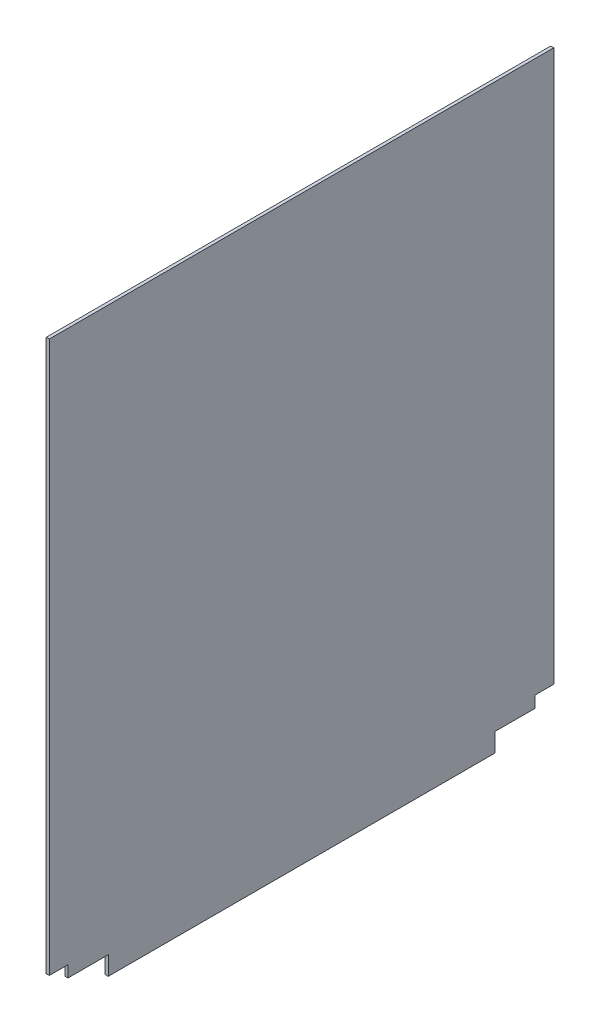
ISO-10303-21;
HEADER;
FILE_DESCRIPTION(('STEP AP214'),'2;1');
FILE_NAME('part.step','',(''),(''),'','','');
FILE_SCHEMA(('AUTOMOTIVE_DESIGN { 1 0 10303 214 1 1 1 1 }'));
ENDSEC;
DATA;
#1=APPLICATION_CONTEXT('core data for automotive mechanical design processes');
#2=APPLICATION_PROTOCOL_DEFINITION('international standard','automotive_design',2000,#1);
#3=PRODUCT_CONTEXT('',#1,'mechanical');
#4=PRODUCT('Part','Part','',(#3));
#5=PRODUCT_RELATED_PRODUCT_CATEGORY('part','',(#4));
#6=PRODUCT_DEFINITION_FORMATION('','',#4);
#7=PRODUCT_DEFINITION_CONTEXT('part definition',#1,'design');
#8=PRODUCT_DEFINITION('design','',#6,#7);
#9=PRODUCT_DEFINITION_SHAPE('','',#8);
#10=(LENGTH_UNIT() NAMED_UNIT(*) SI_UNIT(.MILLI.,.METRE.));
#11=(NAMED_UNIT(*) PLANE_ANGLE_UNIT() SI_UNIT($,.RADIAN.));
#12=(NAMED_UNIT(*) SI_UNIT($,.STERADIAN.) SOLID_ANGLE_UNIT());
#13=UNCERTAINTY_MEASURE_WITH_UNIT(LENGTH_MEASURE(1.E-05),#10,'distance_accuracy_value','');
#14=(GEOMETRIC_REPRESENTATION_CONTEXT(3) GLOBAL_UNCERTAINTY_ASSIGNED_CONTEXT((#13)) GLOBAL_UNIT_ASSIGNED_CONTEXT((#10,
#11,#12)) REPRESENTATION_CONTEXT('',''));
#15=CARTESIAN_POINT('',(0.,0.,0.));
#16=DIRECTION('',(0.,0.,1.));
#17=DIRECTION('',(1.,0.,0.));
#18=AXIS2_PLACEMENT_3D('',#15,#16,#17);
#19=CARTESIAN_POINT('',(3.175,303.0375,-262.95));
#20=DIRECTION('',(0.,0.,1.));
#21=DIRECTION('',(0.,-1.,0.));
#22=AXIS2_PLACEMENT_3D('',#19,#20,#21);
#23=PLANE('',#22);
#24=DIRECTION('',(1.,0.,0.));
#25=VECTOR('',#24,1.);
#26=CARTESIAN_POINT('',(-2.67147415300428E-13,-271.537499999997,-262.95));
#27=LINE('',#26,#25);
#28=CARTESIAN_POINT('',(-2.67147415300428E-13,-271.537499999997,-262.95));
#29=VERTEX_POINT('',#28);
#30=CARTESIAN_POINT('',(3.175,-271.537499999997,-262.95));
#31=VERTEX_POINT('',#30);
#32=EDGE_CURVE('E138',#29,#31,#27,.T.);
#33=ORIENTED_EDGE('',*,*,#32,.F.);
#34=DIRECTION('',(0.,1.,0.));
#35=VECTOR('',#34,1.);
#36=CARTESIAN_POINT('',(0.,303.0375,-262.95));
#37=LINE('',#36,#35);
#38=CARTESIAN_POINT('',(0.,303.0375,-262.95));
#39=VERTEX_POINT('',#38);
#40=EDGE_CURVE('E72',#29,#39,#37,.T.);
#41=ORIENTED_EDGE('',*,*,#40,.T.);
#42=DIRECTION('',(-1.,0.,0.));
#43=VECTOR('',#42,1.);
#44=CARTESIAN_POINT('',(3.175,303.0375,-262.95));
#45=LINE('',#44,#43);
#46=CARTESIAN_POINT('',(3.175,303.0375,-262.95));
#47=VERTEX_POINT('',#46);
#48=EDGE_CURVE('E170',#47,#39,#45,.T.);
#49=ORIENTED_EDGE('',*,*,#48,.F.);
#50=DIRECTION('',(0.,1.,0.));
#51=VECTOR('',#50,1.);
#52=CARTESIAN_POINT('',(3.175,303.0375,-262.95));
#53=LINE('',#52,#51);
#54=EDGE_CURVE('E145',#31,#47,#53,.T.);
#55=ORIENTED_EDGE('',*,*,#54,.F.);
#56=EDGE_LOOP('',(#33,#41,#49,#55));
#57=FACE_BOUND('',#56,.T.);
#58=ADVANCED_FACE('F45',(#57),#23,.F.);
#59=CARTESIAN_POINT('',(3.175,-303.0375,262.95));
#60=DIRECTION('',(0.,1.,0.));
#61=DIRECTION('',(0.,0.,1.));
#62=AXIS2_PLACEMENT_3D('',#59,#60,#61);
#63=PLANE('',#62);
#64=DIRECTION('',(0.,0.,-1.));
#65=VECTOR('',#64,1.);
#66=CARTESIAN_POINT('',(0.,-303.0375,262.95));
#67=LINE('',#66,#65);
#68=CARTESIAN_POINT('',(-2.67147415300428E-13,-303.0375,201.45));
#69=VERTEX_POINT('',#68);
#70=CARTESIAN_POINT('',(-2.67147415300428E-13,-303.0375,-201.450000000001));
#71=VERTEX_POINT('',#70);
#72=EDGE_CURVE('E164',#69,#71,#67,.T.);
#73=ORIENTED_EDGE('',*,*,#72,.T.);
#74=DIRECTION('',(1.,0.,0.));
#75=VECTOR('',#74,1.);
#76=CARTESIAN_POINT('',(-2.67147415300428E-13,-303.0375,-201.450000000001));
#77=LINE('',#76,#75);
#78=CARTESIAN_POINT('',(3.175,-303.0375,-201.450000000001));
#79=VERTEX_POINT('',#78);
#80=EDGE_CURVE('E146',#71,#79,#77,.T.);
#81=ORIENTED_EDGE('',*,*,#80,.T.);
#82=DIRECTION('',(0.,0.,-1.));
#83=VECTOR('',#82,1.);
#84=CARTESIAN_POINT('',(3.175,-303.0375,262.95));
#85=LINE('',#84,#83);
#86=CARTESIAN_POINT('',(3.175,-303.0375,201.45));
#87=VERTEX_POINT('',#86);
#88=EDGE_CURVE('E159',#87,#79,#85,.T.);
#89=ORIENTED_EDGE('',*,*,#88,.F.);
#90=DIRECTION('',(1.,0.,0.));
#91=VECTOR('',#90,1.);
#92=CARTESIAN_POINT('',(-2.67147415300428E-13,-303.0375,201.45));
#93=LINE('',#92,#91);
#94=EDGE_CURVE('E180',#69,#87,#93,.T.);
#95=ORIENTED_EDGE('',*,*,#94,.F.);
#96=EDGE_LOOP('',(#73,#81,#89,#95));
#97=FACE_BOUND('',#96,.T.);
#98=ADVANCED_FACE('F187',(#97),#63,.F.);
#99=CARTESIAN_POINT('',(3.175,0.,0.));
#100=DIRECTION('',(1.,0.,0.));
#101=DIRECTION('',(0.,0.,-1.));
#102=AXIS2_PLACEMENT_3D('',#99,#100,#101);
#103=PLANE('',#102);
#104=DIRECTION('',(0.,0.,-1.));
#105=VECTOR('',#104,1.);
#106=CARTESIAN_POINT('',(3.175,-271.537499999999,-1.92794946191525E-12));
#107=LINE('',#106,#105);
#108=CARTESIAN_POINT('',(3.175,-271.537499999997,-243.450000000001));
#109=VERTEX_POINT('',#108);
#110=EDGE_CURVE('E81',#109,#31,#107,.T.);
#111=ORIENTED_EDGE('',*,*,#110,.T.);
#112=ORIENTED_EDGE('',*,*,#54,.T.);
#113=DIRECTION('',(0.,0.,1.));
#114=VECTOR('',#113,1.);
#115=CARTESIAN_POINT('',(3.175,303.0375,262.95));
#116=LINE('',#115,#114);
#117=CARTESIAN_POINT('',(3.175,303.0375,262.95));
#118=VERTEX_POINT('',#117);
#119=EDGE_CURVE('E61',#47,#118,#116,.T.);
#120=ORIENTED_EDGE('',*,*,#119,.T.);
#121=DIRECTION('',(0.,-1.,0.));
#122=VECTOR('',#121,1.);
#123=CARTESIAN_POINT('',(3.175,303.0375,262.95));
#124=LINE('',#123,#122);
#125=CARTESIAN_POINT('',(3.175,-271.537499999995,262.95));
#126=VERTEX_POINT('',#125);
#127=EDGE_CURVE('E240',#118,#126,#124,.T.);
#128=ORIENTED_EDGE('',*,*,#127,.T.);
#129=DIRECTION('',(0.,0.,-1.));
#130=VECTOR('',#129,1.);
#131=CARTESIAN_POINT('',(3.175,-271.537499999993,-1.92794946190533E-12));
#132=LINE('',#131,#130);
#133=CARTESIAN_POINT('',(3.175,-271.537499999995,243.45));
#134=VERTEX_POINT('',#133);
#135=EDGE_CURVE('E228',#126,#134,#132,.T.);
#136=ORIENTED_EDGE('',*,*,#135,.T.);
#137=DIRECTION('',(0.,-1.,0.));
#138=VECTOR('',#137,1.);
#139=CARTESIAN_POINT('',(3.175,-1.72852383253656E-12,243.450000000002));
#140=LINE('',#139,#138);
#141=CARTESIAN_POINT('',(3.175,-283.537499999995,243.45));
#142=VERTEX_POINT('',#141);
#143=EDGE_CURVE('E225',#134,#142,#140,.T.);
#144=ORIENTED_EDGE('',*,*,#143,.T.);
#145=DIRECTION('',(0.,0.,1.));
#146=VECTOR('',#145,1.);
#147=CARTESIAN_POINT('',(3.175,-283.537499999993,-2.01315092963212E-12));
#148=LINE('',#147,#146);
#149=CARTESIAN_POINT('',(3.175,-283.537499999995,201.45));
#150=VERTEX_POINT('',#149);
#151=EDGE_CURVE('E223',#150,#142,#148,.T.);
#152=ORIENTED_EDGE('',*,*,#151,.F.);
#153=DIRECTION('',(0.,-1.,0.));
#154=VECTOR('',#153,1.);
#155=CARTESIAN_POINT('',(3.175,-1.43031885834664E-12,201.450000000002));
#156=LINE('',#155,#154);
#157=EDGE_CURVE('E231',#150,#87,#156,.T.);
#158=ORIENTED_EDGE('',*,*,#157,.T.);
#159=ORIENTED_EDGE('',*,*,#88,.T.);
#160=DIRECTION('',(0.,1.,0.));
#161=VECTOR('',#160,1.);
#162=CARTESIAN_POINT('',(3.175,1.43031591092473E-12,-201.449999999999));
#163=LINE('',#162,#161);
#164=CARTESIAN_POINT('',(3.175,-283.537499999997,-201.450000000001));
#165=VERTEX_POINT('',#164);
#166=EDGE_CURVE('E152',#79,#165,#163,.T.);
#167=ORIENTED_EDGE('',*,*,#166,.T.);
#168=DIRECTION('',(0.,0.,1.));
#169=VECTOR('',#168,1.);
#170=CARTESIAN_POINT('',(3.175,-283.537499999999,-2.01315092964248E-12));
#171=LINE('',#170,#169);
#172=CARTESIAN_POINT('',(3.175,-283.537499999997,-243.450000000001));
#173=VERTEX_POINT('',#172);
#174=EDGE_CURVE('E233',#173,#165,#171,.T.);
#175=ORIENTED_EDGE('',*,*,#174,.F.);
#176=DIRECTION('',(0.,1.,0.));
#177=VECTOR('',#176,1.);
#178=CARTESIAN_POINT('',(3.175,1.7285202706112E-12,-243.449999999999));
#179=LINE('',#178,#177);
#180=EDGE_CURVE('E235',#173,#109,#179,.T.);
#181=ORIENTED_EDGE('',*,*,#180,.T.);
#182=EDGE_LOOP('',(#111,#112,#120,#128,#136,#144,#152,#158,#159,#167,#175,#181));
#183=FACE_BOUND('',#182,.T.);
#184=ADVANCED_FACE('F242',(#183),#103,.T.);
#185=CARTESIAN_POINT('',(0.,0.,0.));
#186=DIRECTION('',(1.,0.,0.));
#187=DIRECTION('',(0.,0.,-1.));
#188=AXIS2_PLACEMENT_3D('',#185,#186,#187);
#189=PLANE('',#188);
#190=ORIENTED_EDGE('',*,*,#40,.F.);
#191=DIRECTION('',(0.,0.,-1.));
#192=VECTOR('',#191,1.);
#193=CARTESIAN_POINT('',(0.,-271.537499999999,-1.92794946191525E-12));
#194=LINE('',#193,#192);
#195=CARTESIAN_POINT('',(-2.67147415300428E-13,-271.537499999997,-243.450000000001));
#196=VERTEX_POINT('',#195);
#197=EDGE_CURVE('E53',#196,#29,#194,.T.);
#198=ORIENTED_EDGE('',*,*,#197,.F.);
#199=DIRECTION('',(0.,1.,0.));
#200=VECTOR('',#199,1.);
#201=CARTESIAN_POINT('',(0.,-328.672884476705,-243.450000000002));
#202=LINE('',#201,#200);
#203=CARTESIAN_POINT('',(-2.23996168835505E-13,-283.537499999997,-243.450000000001));
#204=VERTEX_POINT('',#203);
#205=EDGE_CURVE('E206',#204,#196,#202,.T.);
#206=ORIENTED_EDGE('',*,*,#205,.F.);
#207=DIRECTION('',(0.,0.,-1.));
#208=VECTOR('',#207,1.);
#209=CARTESIAN_POINT('',(-2.23996168835505E-13,-283.537499999997,-243.450000000001));
#210=LINE('',#209,#208);
#211=CARTESIAN_POINT('',(-2.21177243187043E-13,-283.537499999997,-201.450000000001));
#212=VERTEX_POINT('',#211);
#213=EDGE_CURVE('E194',#212,#204,#210,.T.);
#214=ORIENTED_EDGE('',*,*,#213,.F.);
#215=DIRECTION('',(0.,1.,0.));
#216=VECTOR('',#215,1.);
#217=CARTESIAN_POINT('',(0.,1.43031591092473E-12,-201.449999999999));
#218=LINE('',#217,#216);
#219=EDGE_CURVE('E11',#71,#212,#218,.T.);
#220=ORIENTED_EDGE('',*,*,#219,.F.);
#221=ORIENTED_EDGE('',*,*,#72,.F.);
#222=DIRECTION('',(0.,-1.,0.));
#223=VECTOR('',#222,1.);
#224=CARTESIAN_POINT('',(0.,-1.43031885834664E-12,201.450000000002));
#225=LINE('',#224,#223);
#226=CARTESIAN_POINT('',(-1.72604985859692E-13,-283.537499999995,201.45));
#227=VERTEX_POINT('',#226);
#228=EDGE_CURVE('E144',#227,#69,#225,.T.);
#229=ORIENTED_EDGE('',*,*,#228,.F.);
#230=DIRECTION('',(0.,0.,-1.));
#231=VECTOR('',#230,1.);
#232=CARTESIAN_POINT('',(-1.6978606021123E-13,-283.537499999995,243.45));
#233=LINE('',#232,#231);
#234=CARTESIAN_POINT('',(-1.6978606021123E-13,-283.537499999995,243.45));
#235=VERTEX_POINT('',#234);
#236=EDGE_CURVE('E217',#235,#227,#233,.T.);
#237=ORIENTED_EDGE('',*,*,#236,.F.);
#238=DIRECTION('',(0.,1.,0.));
#239=VECTOR('',#238,1.);
#240=CARTESIAN_POINT('',(0.,-328.672884476703,243.45));
#241=LINE('',#240,#239);
#242=CARTESIAN_POINT('',(-2.12937306676153E-13,-271.537499999995,243.45));
#243=VERTEX_POINT('',#242);
#244=EDGE_CURVE('E215',#235,#243,#241,.T.);
#245=ORIENTED_EDGE('',*,*,#244,.T.);
#246=DIRECTION('',(0.,0.,-1.));
#247=VECTOR('',#246,1.);
#248=CARTESIAN_POINT('',(0.,-271.537499999993,-1.92794946190533E-12));
#249=LINE('',#248,#247);
#250=CARTESIAN_POINT('',(-2.67147415300428E-13,-271.537499999995,262.95));
#251=VERTEX_POINT('',#250);
#252=EDGE_CURVE('E172',#251,#243,#249,.T.);
#253=ORIENTED_EDGE('',*,*,#252,.F.);
#254=DIRECTION('',(0.,-1.,0.));
#255=VECTOR('',#254,1.);
#256=CARTESIAN_POINT('',(0.,303.0375,262.95));
#257=LINE('',#256,#255);
#258=CARTESIAN_POINT('',(0.,303.0375,262.95));
#259=VERTEX_POINT('',#258);
#260=EDGE_CURVE('E154',#259,#251,#257,.T.);
#261=ORIENTED_EDGE('',*,*,#260,.F.);
#262=DIRECTION('',(0.,0.,1.));
#263=VECTOR('',#262,1.);
#264=CARTESIAN_POINT('',(0.,303.0375,262.95));
#265=LINE('',#264,#263);
#266=EDGE_CURVE('E150',#39,#259,#265,.T.);
#267=ORIENTED_EDGE('',*,*,#266,.F.);
#268=EDGE_LOOP('',(#190,#198,#206,#214,#220,#221,#229,#237,#245,#253,#261,#267));
#269=FACE_BOUND('',#268,.T.);
#270=ADVANCED_FACE('F148',(#269),#189,.F.);
#271=CARTESIAN_POINT('',(3.175,303.0375,262.95));
#272=DIRECTION('',(0.,0.,-1.));
#273=DIRECTION('',(0.,1.,0.));
#274=AXIS2_PLACEMENT_3D('',#271,#272,#273);
#275=PLANE('',#274);
#276=ORIENTED_EDGE('',*,*,#260,.T.);
#277=DIRECTION('',(1.,0.,0.));
#278=VECTOR('',#277,1.);
#279=CARTESIAN_POINT('',(-2.67147415300428E-13,-271.537499999995,262.95));
#280=LINE('',#279,#278);
#281=EDGE_CURVE('E190',#251,#126,#280,.T.);
#282=ORIENTED_EDGE('',*,*,#281,.T.);
#283=ORIENTED_EDGE('',*,*,#127,.F.);
#284=DIRECTION('',(-1.,0.,0.));
#285=VECTOR('',#284,1.);
#286=CARTESIAN_POINT('',(3.175,303.0375,262.95));
#287=LINE('',#286,#285);
#288=EDGE_CURVE('E167',#118,#259,#287,.T.);
#289=ORIENTED_EDGE('',*,*,#288,.T.);
#290=EDGE_LOOP('',(#276,#282,#283,#289));
#291=FACE_BOUND('',#290,.T.);
#292=ADVANCED_FACE('F256',(#291),#275,.F.);
#293=CARTESIAN_POINT('',(3.175,303.0375,262.95));
#294=DIRECTION('',(0.,-1.,0.));
#295=DIRECTION('',(0.,0.,-1.));
#296=AXIS2_PLACEMENT_3D('',#293,#294,#295);
#297=PLANE('',#296);
#298=ORIENTED_EDGE('',*,*,#266,.T.);
#299=ORIENTED_EDGE('',*,*,#288,.F.);
#300=ORIENTED_EDGE('',*,*,#119,.F.);
#301=ORIENTED_EDGE('',*,*,#48,.T.);
#302=EDGE_LOOP('',(#298,#299,#300,#301));
#303=FACE_BOUND('',#302,.T.);
#304=ADVANCED_FACE('F258',(#303),#297,.F.);
#305=CARTESIAN_POINT('',(6.68749999999984,-286.537499999995,201.45));
#306=DIRECTION('',(0.,0.,1.));
#307=DIRECTION('',(1.,0.,0.));
#308=AXIS2_PLACEMENT_3D('',#305,#306,#307);
#309=PLANE('',#308);
#310=DIRECTION('',(1.,0.,0.));
#311=VECTOR('',#310,1.);
#312=CARTESIAN_POINT('',(3.37499999999983,-283.537499999995,201.45));
#313=LINE('',#312,#311);
#314=EDGE_CURVE('E183',#227,#150,#313,.T.);
#315=ORIENTED_EDGE('',*,*,#314,.F.);
#316=ORIENTED_EDGE('',*,*,#228,.T.);
#317=ORIENTED_EDGE('',*,*,#94,.T.);
#318=ORIENTED_EDGE('',*,*,#157,.F.);
#319=EDGE_LOOP('',(#315,#316,#317,#318));
#320=FACE_BOUND('',#319,.T.);
#321=ADVANCED_FACE('F179',(#320),#309,.T.);
#322=CARTESIAN_POINT('',(6.68749999999979,-271.537499999995,246.45));
#323=DIRECTION('',(0.,-1.,0.));
#324=DIRECTION('',(-1.,0.,0.));
#325=AXIS2_PLACEMENT_3D('',#322,#323,#324);
#326=PLANE('',#325);
#327=ORIENTED_EDGE('',*,*,#135,.F.);
#328=ORIENTED_EDGE('',*,*,#281,.F.);
#329=ORIENTED_EDGE('',*,*,#252,.T.);
#330=DIRECTION('',(1.,0.,0.));
#331=VECTOR('',#330,1.);
#332=CARTESIAN_POINT('',(3.37499999999979,-271.537499999995,243.45));
#333=LINE('',#332,#331);
#334=EDGE_CURVE('E210',#243,#134,#333,.T.);
#335=ORIENTED_EDGE('',*,*,#334,.T.);
#336=EDGE_LOOP('',(#327,#328,#329,#335));
#337=FACE_BOUND('',#336,.T.);
#338=ADVANCED_FACE('F254',(#337),#326,.T.);
#339=CARTESIAN_POINT('',(3.37499999999999,-328.672884476703,243.45));
#340=DIRECTION('',(0.,0.,1.));
#341=DIRECTION('',(1.,0.,0.));
#342=AXIS2_PLACEMENT_3D('',#339,#340,#341);
#343=PLANE('',#342);
#344=ORIENTED_EDGE('',*,*,#334,.F.);
#345=ORIENTED_EDGE('',*,*,#244,.F.);
#346=DIRECTION('',(-1.,0.,0.));
#347=VECTOR('',#346,1.);
#348=CARTESIAN_POINT('',(3.37499999999983,-283.537499999995,243.45));
#349=LINE('',#348,#347);
#350=EDGE_CURVE('E213',#142,#235,#349,.T.);
#351=ORIENTED_EDGE('',*,*,#350,.F.);
#352=ORIENTED_EDGE('',*,*,#143,.F.);
#353=EDGE_LOOP('',(#344,#345,#351,#352));
#354=FACE_BOUND('',#353,.T.);
#355=ADVANCED_FACE('F252',(#354),#343,.T.);
#356=CARTESIAN_POINT('',(6.68749999999983,-283.537499999995,246.45));
#357=DIRECTION('',(0.,1.,0.));
#358=DIRECTION('',(1.,0.,0.));
#359=AXIS2_PLACEMENT_3D('',#356,#357,#358);
#360=PLANE('',#359);
#361=ORIENTED_EDGE('',*,*,#151,.T.);
#362=ORIENTED_EDGE('',*,*,#350,.T.);
#363=ORIENTED_EDGE('',*,*,#236,.T.);
#364=ORIENTED_EDGE('',*,*,#314,.T.);
#365=EDGE_LOOP('',(#361,#362,#363,#364));
#366=FACE_BOUND('',#365,.T.);
#367=ADVANCED_FACE('F246',(#366),#360,.F.);
#368=CARTESIAN_POINT('',(-3.31250000000021,-286.537499999997,-201.450000000001));
#369=DIRECTION('',(0.,0.,-1.));
#370=DIRECTION('',(-1.,0.,0.));
#371=AXIS2_PLACEMENT_3D('',#368,#369,#370);
#372=PLANE('',#371);
#373=ORIENTED_EDGE('',*,*,#166,.F.);
#374=ORIENTED_EDGE('',*,*,#80,.F.);
#375=ORIENTED_EDGE('',*,*,#219,.T.);
#376=DIRECTION('',(-1.,0.,0.));
#377=VECTOR('',#376,1.);
#378=CARTESIAN_POINT('',(-2.21177243187043E-13,-283.537499999997,-201.450000000001));
#379=LINE('',#378,#377);
#380=EDGE_CURVE('E208',#165,#212,#379,.T.);
#381=ORIENTED_EDGE('',*,*,#380,.F.);
#382=EDGE_LOOP('',(#373,#374,#375,#381));
#383=FACE_BOUND('',#382,.T.);
#384=ADVANCED_FACE('F198',(#383),#372,.T.);
#385=CARTESIAN_POINT('',(-3.31250000000027,-271.537499999997,-246.450000000001));
#386=DIRECTION('',(0.,-1.,0.));
#387=DIRECTION('',(1.,0.,0.));
#388=AXIS2_PLACEMENT_3D('',#385,#386,#387);
#389=PLANE('',#388);
#390=DIRECTION('',(-1.,0.,0.));
#391=VECTOR('',#390,1.);
#392=CARTESIAN_POINT('',(-2.67147415300428E-13,-271.537499999997,-243.450000000001));
#393=LINE('',#392,#391);
#394=EDGE_CURVE('E140',#109,#196,#393,.T.);
#395=ORIENTED_EDGE('',*,*,#394,.T.);
#396=ORIENTED_EDGE('',*,*,#197,.T.);
#397=ORIENTED_EDGE('',*,*,#32,.T.);
#398=ORIENTED_EDGE('',*,*,#110,.F.);
#399=EDGE_LOOP('',(#395,#396,#397,#398));
#400=FACE_BOUND('',#399,.T.);
#401=ADVANCED_FACE('F137',(#400),#389,.T.);
#402=CARTESIAN_POINT('',(0.,-328.672884476705,-243.450000000002));
#403=DIRECTION('',(0.,0.,-1.));
#404=DIRECTION('',(-1.,0.,0.));
#405=AXIS2_PLACEMENT_3D('',#402,#403,#404);
#406=PLANE('',#405);
#407=DIRECTION('',(1.,0.,0.));
#408=VECTOR('',#407,1.);
#409=CARTESIAN_POINT('',(-2.23996168835505E-13,-283.537499999997,-243.450000000001));
#410=LINE('',#409,#408);
#411=EDGE_CURVE('E203',#204,#173,#410,.T.);
#412=ORIENTED_EDGE('',*,*,#411,.F.);
#413=ORIENTED_EDGE('',*,*,#205,.T.);
#414=ORIENTED_EDGE('',*,*,#394,.F.);
#415=ORIENTED_EDGE('',*,*,#180,.F.);
#416=EDGE_LOOP('',(#412,#413,#414,#415));
#417=FACE_BOUND('',#416,.T.);
#418=ADVANCED_FACE('F289',(#417),#406,.T.);
#419=CARTESIAN_POINT('',(-3.31250000000022,-283.537499999997,-246.450000000001));
#420=DIRECTION('',(0.,1.,0.));
#421=DIRECTION('',(-1.,0.,0.));
#422=AXIS2_PLACEMENT_3D('',#419,#420,#421);
#423=PLANE('',#422);
#424=ORIENTED_EDGE('',*,*,#174,.T.);
#425=ORIENTED_EDGE('',*,*,#380,.T.);
#426=ORIENTED_EDGE('',*,*,#213,.T.);
#427=ORIENTED_EDGE('',*,*,#411,.T.);
#428=EDGE_LOOP('',(#424,#425,#426,#427));
#429=FACE_BOUND('',#428,.T.);
#430=ADVANCED_FACE('F292',(#429),#423,.F.);
#431=CLOSED_SHELL('',(#58,#98,#184,#270,#292,#304,#321,#338,#355,#367,#384,#401,#418,#430));
#432=MANIFOLD_SOLID_BREP('B2',#431);
#433=ADVANCED_BREP_SHAPE_REPRESENTATION('',(#18,#432),#14);
#434=SHAPE_DEFINITION_REPRESENTATION(#9,#433);
ENDSEC;
END-ISO-10303-21;
